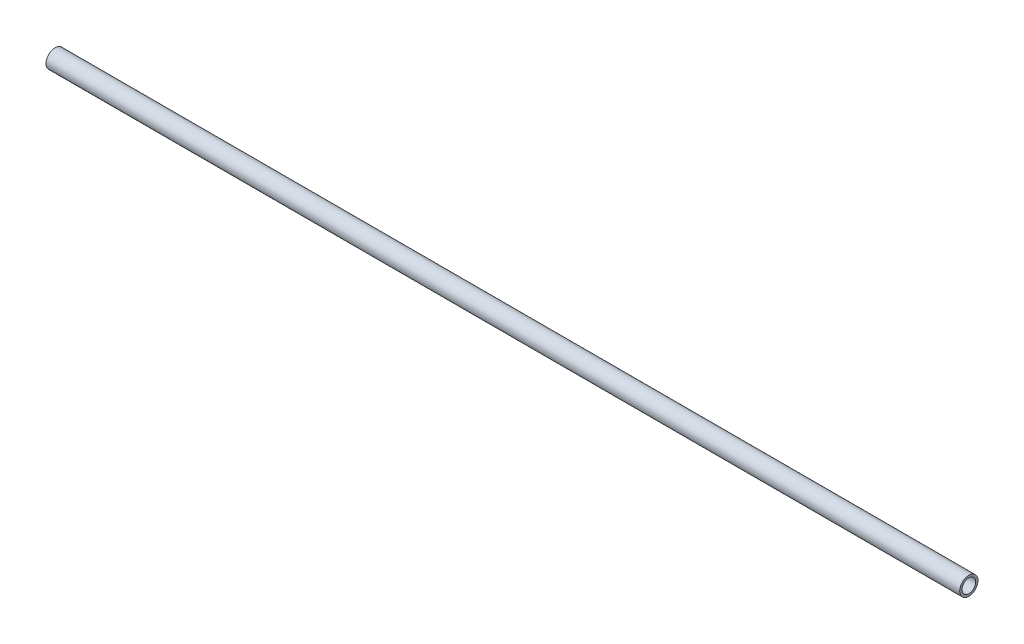
ISO-10303-21;
HEADER;
FILE_DESCRIPTION(('STEP AP214'),'2;1');
FILE_NAME('part.step','',(''),(''),'','','');
FILE_SCHEMA(('AUTOMOTIVE_DESIGN { 1 0 10303 214 1 1 1 1 }'));
ENDSEC;
DATA;
#1=APPLICATION_CONTEXT('core data for automotive mechanical design processes');
#2=APPLICATION_PROTOCOL_DEFINITION('international standard','automotive_design',2000,#1);
#3=PRODUCT_CONTEXT('',#1,'mechanical');
#4=PRODUCT('Part','Part','',(#3));
#5=PRODUCT_RELATED_PRODUCT_CATEGORY('part','',(#4));
#6=PRODUCT_DEFINITION_FORMATION('','',#4);
#7=PRODUCT_DEFINITION_CONTEXT('part definition',#1,'design');
#8=PRODUCT_DEFINITION('design','',#6,#7);
#9=PRODUCT_DEFINITION_SHAPE('','',#8);
#10=(LENGTH_UNIT() NAMED_UNIT(*) SI_UNIT(.MILLI.,.METRE.));
#11=(NAMED_UNIT(*) PLANE_ANGLE_UNIT() SI_UNIT($,.RADIAN.));
#12=(NAMED_UNIT(*) SI_UNIT($,.STERADIAN.) SOLID_ANGLE_UNIT());
#13=UNCERTAINTY_MEASURE_WITH_UNIT(LENGTH_MEASURE(1.E-05),#10,'distance_accuracy_value','');
#14=(GEOMETRIC_REPRESENTATION_CONTEXT(3) GLOBAL_UNCERTAINTY_ASSIGNED_CONTEXT((#13)) GLOBAL_UNIT_ASSIGNED_CONTEXT((#10,
#11,#12)) REPRESENTATION_CONTEXT('',''));
#15=CARTESIAN_POINT('',(0.,0.,0.));
#16=DIRECTION('',(0.,0.,1.));
#17=DIRECTION('',(1.,0.,0.));
#18=AXIS2_PLACEMENT_3D('',#15,#16,#17);
#19=CARTESIAN_POINT('',(200.,0.,0.));
#20=DIRECTION('',(1.,0.,0.));
#21=DIRECTION('',(0.,0.,-1.));
#22=AXIS2_PLACEMENT_3D('',#19,#20,#21);
#23=PLANE('',#22);
#24=CARTESIAN_POINT('',(200.,0.,0.));
#25=DIRECTION('',(1.,0.,0.));
#26=DIRECTION('',(0.,0.,-1.));
#27=AXIS2_PLACEMENT_3D('',#24,#25,#26);
#28=CIRCLE('',#27,2.);
#29=CARTESIAN_POINT('',(200.,0.,-2.));
#30=VERTEX_POINT('',#29);
#31=EDGE_CURVE('E10',#30,#30,#28,.T.);
#32=ORIENTED_EDGE('',*,*,#31,.T.);
#33=EDGE_LOOP('',(#32));
#34=FACE_BOUND('',#33,.T.);
#35=CARTESIAN_POINT('',(200.,0.,0.));
#36=DIRECTION('',(1.,0.,0.));
#37=DIRECTION('',(0.,0.,-1.));
#38=AXIS2_PLACEMENT_3D('',#35,#36,#37);
#39=CIRCLE('',#38,1.5);
#40=CARTESIAN_POINT('',(200.,0.,-1.5));
#41=VERTEX_POINT('',#40);
#42=EDGE_CURVE('E54',#41,#41,#39,.T.);
#43=ORIENTED_EDGE('',*,*,#42,.F.);
#44=EDGE_LOOP('',(#43));
#45=FACE_BOUND('',#44,.T.);
#46=ADVANCED_FACE('F41',(#34,#45),#23,.T.);
#47=CARTESIAN_POINT('',(0.,0.,0.));
#48=DIRECTION('',(1.,0.,0.));
#49=DIRECTION('',(0.,0.,-1.));
#50=AXIS2_PLACEMENT_3D('',#47,#48,#49);
#51=PLANE('',#50);
#52=CARTESIAN_POINT('',(0.,0.,0.));
#53=DIRECTION('',(1.,0.,0.));
#54=DIRECTION('',(0.,0.,-1.));
#55=AXIS2_PLACEMENT_3D('',#52,#53,#54);
#56=CIRCLE('',#55,2.);
#57=CARTESIAN_POINT('',(0.,0.,-2.));
#58=VERTEX_POINT('',#57);
#59=EDGE_CURVE('E45',#58,#58,#56,.T.);
#60=ORIENTED_EDGE('',*,*,#59,.F.);
#61=EDGE_LOOP('',(#60));
#62=FACE_BOUND('',#61,.T.);
#63=CARTESIAN_POINT('',(0.,0.,0.));
#64=DIRECTION('',(1.,0.,0.));
#65=DIRECTION('',(0.,0.,-1.));
#66=AXIS2_PLACEMENT_3D('',#63,#64,#65);
#67=CIRCLE('',#66,1.5);
#68=CARTESIAN_POINT('',(0.,0.,-1.5));
#69=VERTEX_POINT('',#68);
#70=EDGE_CURVE('E56',#69,#69,#67,.T.);
#71=ORIENTED_EDGE('',*,*,#70,.T.);
#72=EDGE_LOOP('',(#71));
#73=FACE_BOUND('',#72,.T.);
#74=ADVANCED_FACE('F68',(#62,#73),#51,.F.);
#75=CARTESIAN_POINT('',(200.,0.,0.));
#76=DIRECTION('',(-1.,0.,0.));
#77=DIRECTION('',(0.,0.,1.));
#78=AXIS2_PLACEMENT_3D('',#75,#76,#77);
#79=CYLINDRICAL_SURFACE('',#78,2.);
#80=ORIENTED_EDGE('',*,*,#31,.F.);
#81=EDGE_LOOP('',(#80));
#82=FACE_BOUND('',#81,.T.);
#83=ORIENTED_EDGE('',*,*,#59,.T.);
#84=EDGE_LOOP('',(#83));
#85=FACE_BOUND('',#84,.T.);
#86=ADVANCED_FACE('F43',(#82,#85),#79,.T.);
#87=CARTESIAN_POINT('',(200.,0.,0.));
#88=DIRECTION('',(-1.,0.,0.));
#89=DIRECTION('',(0.,0.,1.));
#90=AXIS2_PLACEMENT_3D('',#87,#88,#89);
#91=CYLINDRICAL_SURFACE('',#90,1.5);
#92=ORIENTED_EDGE('',*,*,#42,.T.);
#93=EDGE_LOOP('',(#92));
#94=FACE_BOUND('',#93,.T.);
#95=ORIENTED_EDGE('',*,*,#70,.F.);
#96=EDGE_LOOP('',(#95));
#97=FACE_BOUND('',#96,.T.);
#98=ADVANCED_FACE('F64',(#94,#97),#91,.F.);
#99=CLOSED_SHELL('',(#46,#74,#86,#98));
#100=MANIFOLD_SOLID_BREP('B2',#99);
#101=ADVANCED_BREP_SHAPE_REPRESENTATION('',(#18,#100),#14);
#102=SHAPE_DEFINITION_REPRESENTATION(#9,#101);
ENDSEC;
END-ISO-10303-21;
